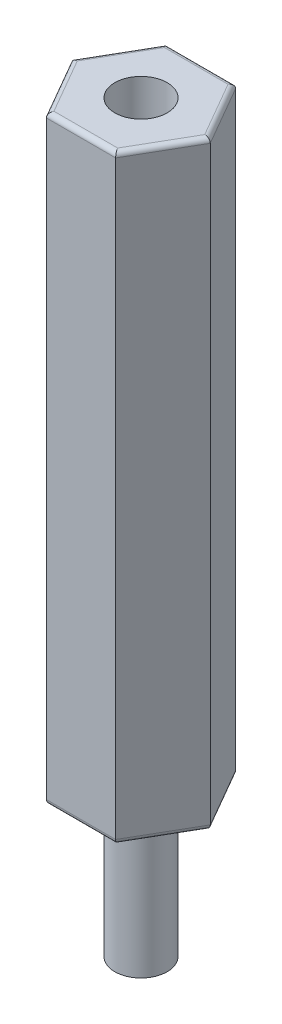
ISO-10303-21;
HEADER;
FILE_DESCRIPTION(('STEP AP214'),'2;1');
FILE_NAME('part.step','',(''),(''),'','','');
FILE_SCHEMA(('AUTOMOTIVE_DESIGN { 1 0 10303 214 1 1 1 1 }'));
ENDSEC;
DATA;
#1=APPLICATION_CONTEXT('core data for automotive mechanical design processes');
#2=APPLICATION_PROTOCOL_DEFINITION('international standard','automotive_design',2000,#1);
#3=PRODUCT_CONTEXT('',#1,'mechanical');
#4=PRODUCT('Part','Part','',(#3));
#5=PRODUCT_RELATED_PRODUCT_CATEGORY('part','',(#4));
#6=PRODUCT_DEFINITION_FORMATION('','',#4);
#7=PRODUCT_DEFINITION_CONTEXT('part definition',#1,'design');
#8=PRODUCT_DEFINITION('design','',#6,#7);
#9=PRODUCT_DEFINITION_SHAPE('','',#8);
#10=(LENGTH_UNIT() NAMED_UNIT(*) SI_UNIT(.MILLI.,.METRE.));
#11=(NAMED_UNIT(*) PLANE_ANGLE_UNIT() SI_UNIT($,.RADIAN.));
#12=(NAMED_UNIT(*) SI_UNIT($,.STERADIAN.) SOLID_ANGLE_UNIT());
#13=UNCERTAINTY_MEASURE_WITH_UNIT(LENGTH_MEASURE(1.E-05),#10,'distance_accuracy_value','');
#14=(GEOMETRIC_REPRESENTATION_CONTEXT(3) GLOBAL_UNCERTAINTY_ASSIGNED_CONTEXT((#13)) GLOBAL_UNIT_ASSIGNED_CONTEXT((#10,
#11,#12)) REPRESENTATION_CONTEXT('',''));
#15=CARTESIAN_POINT('',(0.,0.,0.));
#16=DIRECTION('',(0.,0.,1.));
#17=DIRECTION('',(1.,0.,0.));
#18=AXIS2_PLACEMENT_3D('',#15,#16,#17);
#19=CARTESIAN_POINT('',(2.88675134594813,0.,0.));
#20=DIRECTION('',(0.,1.,0.));
#21=DIRECTION('',(0.,0.,1.));
#22=AXIS2_PLACEMENT_3D('',#19,#20,#21);
#23=PLANE('',#22);
#24=DIRECTION('',(0.5,0.,-0.866025403784439));
#25=VECTOR('',#24,1.);
#26=CARTESIAN_POINT('',(2.71354626519124,0.,-0.100000000000001));
#27=LINE('',#26,#25);
#28=CARTESIAN_POINT('',(2.65581123827228,0.,0.));
#29=VERTEX_POINT('',#28);
#30=CARTESIAN_POINT('',(1.32790561913614,0.,2.3));
#31=VERTEX_POINT('',#30);
#32=EDGE_CURVE('E188',#29,#31,#27,.F.);
#33=ORIENTED_EDGE('',*,*,#32,.T.);
#34=DIRECTION('',(1.,0.,0.));
#35=VECTOR('',#34,1.);
#36=CARTESIAN_POINT('',(2.88675134594813,0.,2.3));
#37=LINE('',#36,#35);
#38=CARTESIAN_POINT('',(-1.32790561913614,0.,2.3));
#39=VERTEX_POINT('',#38);
#40=EDGE_CURVE('E41',#31,#39,#37,.F.);
#41=ORIENTED_EDGE('',*,*,#40,.T.);
#42=DIRECTION('',(0.5,0.,0.866025403784439));
#43=VECTOR('',#42,1.);
#44=CARTESIAN_POINT('',(-1.27017059221718,0.,2.4));
#45=LINE('',#44,#43);
#46=CARTESIAN_POINT('',(-2.65581123827228,0.,0.));
#47=VERTEX_POINT('',#46);
#48=EDGE_CURVE('E55',#39,#47,#45,.F.);
#49=ORIENTED_EDGE('',*,*,#48,.T.);
#50=DIRECTION('',(-0.5,0.,0.866025403784439));
#51=VECTOR('',#50,1.);
#52=CARTESIAN_POINT('',(-1.27017059221718,0.,-2.4));
#53=LINE('',#52,#51);
#54=CARTESIAN_POINT('',(-1.32790561913614,0.,-2.3));
#55=VERTEX_POINT('',#54);
#56=EDGE_CURVE('E194',#47,#55,#53,.F.);
#57=ORIENTED_EDGE('',*,*,#56,.T.);
#58=DIRECTION('',(-1.,0.,0.));
#59=VECTOR('',#58,1.);
#60=CARTESIAN_POINT('',(2.88675134594813,0.,-2.3));
#61=LINE('',#60,#59);
#62=CARTESIAN_POINT('',(1.32790561913614,0.,-2.3));
#63=VERTEX_POINT('',#62);
#64=EDGE_CURVE('E192',#55,#63,#61,.F.);
#65=ORIENTED_EDGE('',*,*,#64,.T.);
#66=DIRECTION('',(-0.5,0.,-0.866025403784439));
#67=VECTOR('',#66,1.);
#68=CARTESIAN_POINT('',(2.71354626519124,0.,0.0999999999999995));
#69=LINE('',#68,#67);
#70=EDGE_CURVE('E190',#63,#29,#69,.F.);
#71=ORIENTED_EDGE('',*,*,#70,.T.);
#72=EDGE_LOOP('',(#33,#41,#49,#57,#65,#71));
#73=FACE_BOUND('',#72,.T.);
#74=CARTESIAN_POINT('',(0.,0.,0.));
#75=DIRECTION('',(0.,1.,0.));
#76=DIRECTION('',(0.,0.,1.));
#77=AXIS2_PLACEMENT_3D('',#74,#75,#76);
#78=CIRCLE('',#77,1.0922);
#79=CARTESIAN_POINT('',(0.,0.,1.0922));
#80=VERTEX_POINT('',#79);
#81=EDGE_CURVE('E11',#80,#80,#78,.F.);
#82=ORIENTED_EDGE('',*,*,#81,.F.);
#83=EDGE_LOOP('',(#82));
#84=FACE_BOUND('',#83,.T.);
#85=ADVANCED_FACE('F33',(#73,#84),#23,.F.);
#86=CARTESIAN_POINT('',(1.44337567297406,25.,2.5));
#87=DIRECTION('',(-0.866025403784439,0.,-0.5));
#88=DIRECTION('',(-0.5,0.,0.866025403784439));
#89=AXIS2_PLACEMENT_3D('',#86,#87,#88);
#90=PLANE('',#89);
#91=DIRECTION('',(0.,-1.,0.));
#92=VECTOR('',#91,1.);
#93=CARTESIAN_POINT('',(2.88675134594813,25.,0.));
#94=LINE('',#93,#92);
#95=CARTESIAN_POINT('',(2.88675134594813,24.8,0.));
#96=VERTEX_POINT('',#95);
#97=CARTESIAN_POINT('',(2.88675134594813,0.199999999999999,0.));
#98=VERTEX_POINT('',#97);
#99=EDGE_CURVE('E149',#96,#98,#94,.T.);
#100=ORIENTED_EDGE('',*,*,#99,.F.);
#101=DIRECTION('',(0.5,0.,-0.866025403784439));
#102=VECTOR('',#101,1.);
#103=CARTESIAN_POINT('',(1.44337567297406,24.8,2.5));
#104=LINE('',#103,#102);
#105=CARTESIAN_POINT('',(1.44337567297406,24.8,2.5));
#106=VERTEX_POINT('',#105);
#107=EDGE_CURVE('E140',#96,#106,#104,.F.);
#108=ORIENTED_EDGE('',*,*,#107,.T.);
#109=DIRECTION('',(0.,-1.,0.));
#110=VECTOR('',#109,1.);
#111=CARTESIAN_POINT('',(1.44337567297406,25.,2.5));
#112=LINE('',#111,#110);
#113=CARTESIAN_POINT('',(1.44337567297406,0.199999999999999,2.5));
#114=VERTEX_POINT('',#113);
#115=EDGE_CURVE('E208',#106,#114,#112,.T.);
#116=ORIENTED_EDGE('',*,*,#115,.T.);
#117=DIRECTION('',(0.5,0.,-0.866025403784439));
#118=VECTOR('',#117,1.);
#119=CARTESIAN_POINT('',(1.44337567297406,0.199999999999999,2.5));
#120=LINE('',#119,#118);
#121=EDGE_CURVE('E181',#114,#98,#120,.T.);
#122=ORIENTED_EDGE('',*,*,#121,.T.);
#123=EDGE_LOOP('',(#100,#108,#116,#122));
#124=FACE_BOUND('',#123,.T.);
#125=ADVANCED_FACE('F253',(#124),#90,.F.);
#126=CARTESIAN_POINT('',(2.88675134594813,25.,0.));
#127=DIRECTION('',(-0.866025403784439,0.,0.5));
#128=DIRECTION('',(0.5,0.,0.866025403784439));
#129=AXIS2_PLACEMENT_3D('',#126,#127,#128);
#130=PLANE('',#129);
#131=DIRECTION('',(0.,-1.,0.));
#132=VECTOR('',#131,1.);
#133=CARTESIAN_POINT('',(1.44337567297406,25.,-2.5));
#134=LINE('',#133,#132);
#135=CARTESIAN_POINT('',(1.44337567297406,24.8,-2.5));
#136=VERTEX_POINT('',#135);
#137=CARTESIAN_POINT('',(1.44337567297406,0.199999999999999,-2.5));
#138=VERTEX_POINT('',#137);
#139=EDGE_CURVE('E152',#136,#138,#134,.T.);
#140=ORIENTED_EDGE('',*,*,#139,.F.);
#141=DIRECTION('',(-0.5,0.,-0.866025403784439));
#142=VECTOR('',#141,1.);
#143=CARTESIAN_POINT('',(2.88675134594813,24.8,0.));
#144=LINE('',#143,#142);
#145=EDGE_CURVE('E186',#136,#96,#144,.F.);
#146=ORIENTED_EDGE('',*,*,#145,.T.);
#147=ORIENTED_EDGE('',*,*,#99,.T.);
#148=DIRECTION('',(-0.5,0.,-0.866025403784439));
#149=VECTOR('',#148,1.);
#150=CARTESIAN_POINT('',(2.88675134594813,0.199999999999999,0.));
#151=LINE('',#150,#149);
#152=EDGE_CURVE('E184',#98,#138,#151,.T.);
#153=ORIENTED_EDGE('',*,*,#152,.T.);
#154=EDGE_LOOP('',(#140,#146,#147,#153));
#155=FACE_BOUND('',#154,.T.);
#156=ADVANCED_FACE('F271',(#155),#130,.F.);
#157=CARTESIAN_POINT('',(1.44337567297406,25.,-2.5));
#158=DIRECTION('',(0.,0.,1.));
#159=DIRECTION('',(1.,0.,0.));
#160=AXIS2_PLACEMENT_3D('',#157,#158,#159);
#161=PLANE('',#160);
#162=DIRECTION('',(0.,-1.,0.));
#163=VECTOR('',#162,1.);
#164=CARTESIAN_POINT('',(-1.44337567297406,25.,-2.5));
#165=LINE('',#164,#163);
#166=CARTESIAN_POINT('',(-1.44337567297406,24.8,-2.5));
#167=VERTEX_POINT('',#166);
#168=CARTESIAN_POINT('',(-1.44337567297406,0.199999999999999,-2.5));
#169=VERTEX_POINT('',#168);
#170=EDGE_CURVE('E262',#167,#169,#165,.T.);
#171=ORIENTED_EDGE('',*,*,#170,.F.);
#172=DIRECTION('',(-1.,0.,0.));
#173=VECTOR('',#172,1.);
#174=CARTESIAN_POINT('',(1.44337567297406,24.8,-2.5));
#175=LINE('',#174,#173);
#176=EDGE_CURVE('E165',#167,#136,#175,.F.);
#177=ORIENTED_EDGE('',*,*,#176,.T.);
#178=ORIENTED_EDGE('',*,*,#139,.T.);
#179=DIRECTION('',(-1.,0.,0.));
#180=VECTOR('',#179,1.);
#181=CARTESIAN_POINT('',(1.44337567297406,0.199999999999999,-2.5));
#182=LINE('',#181,#180);
#183=EDGE_CURVE('E163',#138,#169,#182,.T.);
#184=ORIENTED_EDGE('',*,*,#183,.T.);
#185=EDGE_LOOP('',(#171,#177,#178,#184));
#186=FACE_BOUND('',#185,.T.);
#187=ADVANCED_FACE('F268',(#186),#161,.F.);
#188=CARTESIAN_POINT('',(-1.44337567297406,25.,-2.5));
#189=DIRECTION('',(0.866025403784439,0.,0.5));
#190=DIRECTION('',(0.5,0.,-0.866025403784439));
#191=AXIS2_PLACEMENT_3D('',#188,#189,#190);
#192=PLANE('',#191);
#193=DIRECTION('',(0.,-1.,0.));
#194=VECTOR('',#193,1.);
#195=CARTESIAN_POINT('',(-2.88675134594813,25.,0.));
#196=LINE('',#195,#194);
#197=CARTESIAN_POINT('',(-2.88675134594813,24.8,0.));
#198=VERTEX_POINT('',#197);
#199=CARTESIAN_POINT('',(-2.88675134594813,0.199999999999999,0.));
#200=VERTEX_POINT('',#199);
#201=EDGE_CURVE('E255',#198,#200,#196,.T.);
#202=ORIENTED_EDGE('',*,*,#201,.F.);
#203=DIRECTION('',(-0.5,0.,0.866025403784439));
#204=VECTOR('',#203,1.);
#205=CARTESIAN_POINT('',(-1.44337567297406,24.8,-2.5));
#206=LINE('',#205,#204);
#207=EDGE_CURVE('E170',#198,#167,#206,.F.);
#208=ORIENTED_EDGE('',*,*,#207,.T.);
#209=ORIENTED_EDGE('',*,*,#170,.T.);
#210=DIRECTION('',(-0.5,0.,0.866025403784439));
#211=VECTOR('',#210,1.);
#212=CARTESIAN_POINT('',(-1.44337567297406,0.199999999999999,-2.5));
#213=LINE('',#212,#211);
#214=EDGE_CURVE('E168',#169,#200,#213,.T.);
#215=ORIENTED_EDGE('',*,*,#214,.T.);
#216=EDGE_LOOP('',(#202,#208,#209,#215));
#217=FACE_BOUND('',#216,.T.);
#218=ADVANCED_FACE('F278',(#217),#192,.F.);
#219=CARTESIAN_POINT('',(-2.88675134594813,25.,0.));
#220=DIRECTION('',(0.866025403784439,0.,-0.5));
#221=DIRECTION('',(-0.5,0.,-0.866025403784439));
#222=AXIS2_PLACEMENT_3D('',#219,#220,#221);
#223=PLANE('',#222);
#224=DIRECTION('',(0.,-1.,0.));
#225=VECTOR('',#224,1.);
#226=CARTESIAN_POINT('',(-1.44337567297406,25.,2.5));
#227=LINE('',#226,#225);
#228=CARTESIAN_POINT('',(-1.44337567297406,24.8,2.5));
#229=VERTEX_POINT('',#228);
#230=CARTESIAN_POINT('',(-1.44337567297406,0.199999999999999,2.5));
#231=VERTEX_POINT('',#230);
#232=EDGE_CURVE('E250',#229,#231,#227,.T.);
#233=ORIENTED_EDGE('',*,*,#232,.F.);
#234=DIRECTION('',(0.5,0.,0.866025403784439));
#235=VECTOR('',#234,1.);
#236=CARTESIAN_POINT('',(-2.88675134594813,24.8,0.));
#237=LINE('',#236,#235);
#238=EDGE_CURVE('E174',#229,#198,#237,.F.);
#239=ORIENTED_EDGE('',*,*,#238,.T.);
#240=ORIENTED_EDGE('',*,*,#201,.T.);
#241=DIRECTION('',(0.5,0.,0.866025403784439));
#242=VECTOR('',#241,1.);
#243=CARTESIAN_POINT('',(-2.88675134594813,0.199999999999999,0.));
#244=LINE('',#243,#242);
#245=EDGE_CURVE('E172',#200,#231,#244,.T.);
#246=ORIENTED_EDGE('',*,*,#245,.T.);
#247=EDGE_LOOP('',(#233,#239,#240,#246));
#248=FACE_BOUND('',#247,.T.);
#249=ADVANCED_FACE('F290',(#248),#223,.F.);
#250=CARTESIAN_POINT('',(-1.44337567297406,25.,2.5));
#251=DIRECTION('',(0.,0.,-1.));
#252=DIRECTION('',(-1.,0.,0.));
#253=AXIS2_PLACEMENT_3D('',#250,#251,#252);
#254=PLANE('',#253);
#255=ORIENTED_EDGE('',*,*,#115,.F.);
#256=DIRECTION('',(1.,0.,0.));
#257=VECTOR('',#256,1.);
#258=CARTESIAN_POINT('',(-1.44337567297406,24.8,2.5));
#259=LINE('',#258,#257);
#260=EDGE_CURVE('E179',#106,#229,#259,.F.);
#261=ORIENTED_EDGE('',*,*,#260,.T.);
#262=ORIENTED_EDGE('',*,*,#232,.T.);
#263=DIRECTION('',(1.,0.,0.));
#264=VECTOR('',#263,1.);
#265=CARTESIAN_POINT('',(-1.44337567297406,0.199999999999999,2.5));
#266=LINE('',#265,#264);
#267=EDGE_CURVE('E176',#231,#114,#266,.T.);
#268=ORIENTED_EDGE('',*,*,#267,.T.);
#269=EDGE_LOOP('',(#255,#261,#262,#268));
#270=FACE_BOUND('',#269,.T.);
#271=ADVANCED_FACE('F247',(#270),#254,.F.);
#272=CARTESIAN_POINT('',(2.88675134594813,25.,0.));
#273=DIRECTION('',(0.,1.,0.));
#274=DIRECTION('',(0.,0.,1.));
#275=AXIS2_PLACEMENT_3D('',#272,#273,#274);
#276=PLANE('',#275);
#277=CARTESIAN_POINT('',(0.,25.,0.));
#278=DIRECTION('',(0.,1.,0.));
#279=DIRECTION('',(0.,0.,1.));
#280=AXIS2_PLACEMENT_3D('',#277,#278,#279);
#281=CIRCLE('',#280,1.0922);
#282=CARTESIAN_POINT('',(0.,25.,1.0922));
#283=VERTEX_POINT('',#282);
#284=EDGE_CURVE('E373',#283,#283,#281,.T.);
#285=ORIENTED_EDGE('',*,*,#284,.F.);
#286=EDGE_LOOP('',(#285));
#287=FACE_BOUND('',#286,.T.);
#288=DIRECTION('',(-0.5,0.,-0.866025403784439));
#289=VECTOR('',#288,1.);
#290=CARTESIAN_POINT('',(1.27017059221718,25.,-2.4));
#291=LINE('',#290,#289);
#292=CARTESIAN_POINT('',(2.65581123827228,25.,0.));
#293=VERTEX_POINT('',#292);
#294=CARTESIAN_POINT('',(1.32790561913614,25.,-2.3));
#295=VERTEX_POINT('',#294);
#296=EDGE_CURVE('E128',#293,#295,#291,.T.);
#297=ORIENTED_EDGE('',*,*,#296,.T.);
#298=DIRECTION('',(-1.,0.,0.));
#299=VECTOR('',#298,1.);
#300=CARTESIAN_POINT('',(-1.44337567297406,25.,-2.3));
#301=LINE('',#300,#299);
#302=CARTESIAN_POINT('',(-1.32790561913614,25.,-2.3));
#303=VERTEX_POINT('',#302);
#304=EDGE_CURVE('E161',#295,#303,#301,.T.);
#305=ORIENTED_EDGE('',*,*,#304,.T.);
#306=DIRECTION('',(-0.5,0.,0.866025403784439));
#307=VECTOR('',#306,1.);
#308=CARTESIAN_POINT('',(-2.71354626519124,25.,0.100000000000001));
#309=LINE('',#308,#307);
#310=CARTESIAN_POINT('',(-2.65581123827228,25.,0.));
#311=VERTEX_POINT('',#310);
#312=EDGE_CURVE('E159',#303,#311,#309,.T.);
#313=ORIENTED_EDGE('',*,*,#312,.T.);
#314=DIRECTION('',(0.5,0.,0.866025403784439));
#315=VECTOR('',#314,1.);
#316=CARTESIAN_POINT('',(-1.27017059221718,25.,2.4));
#317=LINE('',#316,#315);
#318=CARTESIAN_POINT('',(-1.32790561913614,25.,2.3));
#319=VERTEX_POINT('',#318);
#320=EDGE_CURVE('E157',#311,#319,#317,.T.);
#321=ORIENTED_EDGE('',*,*,#320,.T.);
#322=DIRECTION('',(1.,0.,0.));
#323=VECTOR('',#322,1.);
#324=CARTESIAN_POINT('',(1.44337567297406,25.,2.3));
#325=LINE('',#324,#323);
#326=CARTESIAN_POINT('',(1.32790561913614,25.,2.3));
#327=VERTEX_POINT('',#326);
#328=EDGE_CURVE('E131',#319,#327,#325,.T.);
#329=ORIENTED_EDGE('',*,*,#328,.T.);
#330=DIRECTION('',(0.5,0.,-0.866025403784439));
#331=VECTOR('',#330,1.);
#332=CARTESIAN_POINT('',(2.71354626519124,25.,-0.100000000000001));
#333=LINE('',#332,#331);
#334=EDGE_CURVE('E123',#327,#293,#333,.T.);
#335=ORIENTED_EDGE('',*,*,#334,.T.);
#336=EDGE_LOOP('',(#297,#305,#313,#321,#329,#335));
#337=FACE_BOUND('',#336,.T.);
#338=ADVANCED_FACE('F125',(#287,#337),#276,.T.);
#339=CARTESIAN_POINT('',(2.88675134594813,24.8,2.3));
#340=DIRECTION('',(-1.,0.,0.));
#341=DIRECTION('',(0.,0.,1.));
#342=AXIS2_PLACEMENT_3D('',#339,#340,#341);
#343=CYLINDRICAL_SURFACE('',#342,0.2);
#344=CARTESIAN_POINT('',(-1.32790561913614,24.8,2.3));
#345=DIRECTION('',(-0.866025403784439,0.,-0.5));
#346=DIRECTION('',(-0.5,0.,0.866025403784439));
#347=AXIS2_PLACEMENT_3D('',#344,#345,#346);
#348=ELLIPSE('',#347,0.23094010767585,0.2);
#349=EDGE_CURVE('E143',#229,#319,#348,.T.);
#350=ORIENTED_EDGE('',*,*,#349,.F.);
#351=ORIENTED_EDGE('',*,*,#260,.F.);
#352=CARTESIAN_POINT('',(1.32790561913614,24.8,2.3));
#353=DIRECTION('',(-0.866025403784438,0.,0.5));
#354=DIRECTION('',(0.5,0.,0.866025403784439));
#355=AXIS2_PLACEMENT_3D('',#352,#353,#354);
#356=ELLIPSE('',#355,0.23094010767585,0.2);
#357=EDGE_CURVE('E206',#327,#106,#356,.F.);
#358=ORIENTED_EDGE('',*,*,#357,.F.);
#359=ORIENTED_EDGE('',*,*,#328,.F.);
#360=EDGE_LOOP('',(#350,#351,#358,#359));
#361=FACE_BOUND('',#360,.T.);
#362=ADVANCED_FACE('F313',(#361),#343,.T.);
#363=CARTESIAN_POINT('',(2.71354626519124,24.8,-0.100000000000001));
#364=DIRECTION('',(-0.5,0.,0.866025403784439));
#365=DIRECTION('',(0.866025403784439,0.,0.5));
#366=AXIS2_PLACEMENT_3D('',#363,#364,#365);
#367=CYLINDRICAL_SURFACE('',#366,0.2);
#368=ORIENTED_EDGE('',*,*,#357,.T.);
#369=ORIENTED_EDGE('',*,*,#107,.F.);
#370=CARTESIAN_POINT('',(2.65581123827228,24.8,0.));
#371=DIRECTION('',(0.,0.,1.));
#372=DIRECTION('',(1.,0.,0.));
#373=AXIS2_PLACEMENT_3D('',#370,#371,#372);
#374=ELLIPSE('',#373,0.23094010767585,0.2);
#375=EDGE_CURVE('E138',#293,#96,#374,.F.);
#376=ORIENTED_EDGE('',*,*,#375,.F.);
#377=ORIENTED_EDGE('',*,*,#334,.F.);
#378=EDGE_LOOP('',(#368,#369,#376,#377));
#379=FACE_BOUND('',#378,.T.);
#380=ADVANCED_FACE('F139',(#379),#367,.T.);
#381=CARTESIAN_POINT('',(-1.27017059221718,24.8,2.4));
#382=DIRECTION('',(-0.5,0.,-0.866025403784439));
#383=DIRECTION('',(-0.866025403784439,0.,0.5));
#384=AXIS2_PLACEMENT_3D('',#381,#382,#383);
#385=CYLINDRICAL_SURFACE('',#384,0.2);
#386=ORIENTED_EDGE('',*,*,#349,.T.);
#387=ORIENTED_EDGE('',*,*,#320,.F.);
#388=CARTESIAN_POINT('',(-2.65581123827228,24.8,0.));
#389=DIRECTION('',(0.,0.,-1.));
#390=DIRECTION('',(-1.,0.,0.));
#391=AXIS2_PLACEMENT_3D('',#388,#389,#390);
#392=ELLIPSE('',#391,0.23094010767585,0.2);
#393=EDGE_CURVE('E144',#198,#311,#392,.T.);
#394=ORIENTED_EDGE('',*,*,#393,.F.);
#395=ORIENTED_EDGE('',*,*,#238,.F.);
#396=EDGE_LOOP('',(#386,#387,#394,#395));
#397=FACE_BOUND('',#396,.T.);
#398=ADVANCED_FACE('F304',(#397),#385,.T.);
#399=CARTESIAN_POINT('',(2.71354626519124,24.8,0.0999999999999995));
#400=DIRECTION('',(0.5,0.,0.866025403784439));
#401=DIRECTION('',(0.866025403784439,0.,-0.5));
#402=AXIS2_PLACEMENT_3D('',#399,#400,#401);
#403=CYLINDRICAL_SURFACE('',#402,0.2);
#404=ORIENTED_EDGE('',*,*,#375,.T.);
#405=ORIENTED_EDGE('',*,*,#145,.F.);
#406=CARTESIAN_POINT('',(1.32790561913614,24.8,-2.3));
#407=DIRECTION('',(0.866025403784439,0.,0.5));
#408=DIRECTION('',(-0.5,0.,0.866025403784439));
#409=AXIS2_PLACEMENT_3D('',#406,#407,#408);
#410=ELLIPSE('',#409,0.23094010767585,0.2);
#411=EDGE_CURVE('E147',#295,#136,#410,.F.);
#412=ORIENTED_EDGE('',*,*,#411,.F.);
#413=ORIENTED_EDGE('',*,*,#296,.F.);
#414=EDGE_LOOP('',(#404,#405,#412,#413));
#415=FACE_BOUND('',#414,.T.);
#416=ADVANCED_FACE('F146',(#415),#403,.T.);
#417=CARTESIAN_POINT('',(-1.27017059221718,24.8,-2.4));
#418=DIRECTION('',(0.5,0.,-0.866025403784439));
#419=DIRECTION('',(-0.866025403784439,0.,-0.5));
#420=AXIS2_PLACEMENT_3D('',#417,#418,#419);
#421=CYLINDRICAL_SURFACE('',#420,0.2);
#422=ORIENTED_EDGE('',*,*,#393,.T.);
#423=ORIENTED_EDGE('',*,*,#312,.F.);
#424=CARTESIAN_POINT('',(-1.32790561913614,24.8,-2.3));
#425=DIRECTION('',(0.866025403784439,0.,-0.5));
#426=DIRECTION('',(-0.5,0.,-0.866025403784439));
#427=AXIS2_PLACEMENT_3D('',#424,#425,#426);
#428=ELLIPSE('',#427,0.23094010767585,0.2);
#429=EDGE_CURVE('E198',#167,#303,#428,.T.);
#430=ORIENTED_EDGE('',*,*,#429,.F.);
#431=ORIENTED_EDGE('',*,*,#207,.F.);
#432=EDGE_LOOP('',(#422,#423,#430,#431));
#433=FACE_BOUND('',#432,.T.);
#434=ADVANCED_FACE('F308',(#433),#421,.T.);
#435=CARTESIAN_POINT('',(2.88675134594813,24.8,-2.3));
#436=DIRECTION('',(1.,0.,0.));
#437=DIRECTION('',(0.,0.,-1.));
#438=AXIS2_PLACEMENT_3D('',#435,#436,#437);
#439=CYLINDRICAL_SURFACE('',#438,0.2);
#440=ORIENTED_EDGE('',*,*,#411,.T.);
#441=ORIENTED_EDGE('',*,*,#176,.F.);
#442=ORIENTED_EDGE('',*,*,#429,.T.);
#443=ORIENTED_EDGE('',*,*,#304,.F.);
#444=EDGE_LOOP('',(#440,#441,#442,#443));
#445=FACE_BOUND('',#444,.T.);
#446=ADVANCED_FACE('F310',(#445),#439,.T.);
#447=CARTESIAN_POINT('',(1.44337567297406,0.199999999999999,-2.3));
#448=DIRECTION('',(-1.,0.,0.));
#449=DIRECTION('',(0.,0.,1.));
#450=AXIS2_PLACEMENT_3D('',#447,#448,#449);
#451=CYLINDRICAL_SURFACE('',#450,0.2);
#452=CARTESIAN_POINT('',(1.32790561913614,0.199999999999999,-2.3));
#453=DIRECTION('',(-0.866025403784439,0.,-0.5));
#454=DIRECTION('',(0.5,0.,-0.866025403784439));
#455=AXIS2_PLACEMENT_3D('',#452,#453,#454);
#456=ELLIPSE('',#455,0.23094010767585,0.2);
#457=EDGE_CURVE('E219',#63,#138,#456,.F.);
#458=ORIENTED_EDGE('',*,*,#457,.F.);
#459=ORIENTED_EDGE('',*,*,#64,.F.);
#460=CARTESIAN_POINT('',(-1.32790561913614,0.199999999999999,-2.3));
#461=DIRECTION('',(-0.866025403784439,0.,0.5));
#462=DIRECTION('',(-0.5,0.,-0.866025403784439));
#463=AXIS2_PLACEMENT_3D('',#460,#461,#462);
#464=ELLIPSE('',#463,0.23094010767585,0.2);
#465=EDGE_CURVE('E200',#169,#55,#464,.T.);
#466=ORIENTED_EDGE('',*,*,#465,.F.);
#467=ORIENTED_EDGE('',*,*,#183,.F.);
#468=EDGE_LOOP('',(#458,#459,#466,#467));
#469=FACE_BOUND('',#468,.T.);
#470=ADVANCED_FACE('F35',(#469),#451,.T.);
#471=CARTESIAN_POINT('',(-1.27017059221718,0.199999999999999,-2.4));
#472=DIRECTION('',(-0.5,0.,0.866025403784439));
#473=DIRECTION('',(0.866025403784439,0.,0.5));
#474=AXIS2_PLACEMENT_3D('',#471,#472,#473);
#475=CYLINDRICAL_SURFACE('',#474,0.2);
#476=ORIENTED_EDGE('',*,*,#465,.T.);
#477=ORIENTED_EDGE('',*,*,#56,.F.);
#478=CARTESIAN_POINT('',(-2.65581123827228,0.199999999999999,0.));
#479=DIRECTION('',(0.,0.,1.));
#480=DIRECTION('',(-1.,0.,0.));
#481=AXIS2_PLACEMENT_3D('',#478,#479,#480);
#482=ELLIPSE('',#481,0.23094010767585,0.2);
#483=EDGE_CURVE('E216',#200,#47,#482,.T.);
#484=ORIENTED_EDGE('',*,*,#483,.F.);
#485=ORIENTED_EDGE('',*,*,#214,.F.);
#486=EDGE_LOOP('',(#476,#477,#484,#485));
#487=FACE_BOUND('',#486,.T.);
#488=ADVANCED_FACE('F225',(#487),#475,.T.);
#489=CARTESIAN_POINT('',(2.71354626519124,0.199999999999999,0.0999999999999992));
#490=DIRECTION('',(-0.5,0.,-0.866025403784439));
#491=DIRECTION('',(-0.866025403784439,0.,0.5));
#492=AXIS2_PLACEMENT_3D('',#489,#490,#491);
#493=CYLINDRICAL_SURFACE('',#492,0.2);
#494=ORIENTED_EDGE('',*,*,#457,.T.);
#495=ORIENTED_EDGE('',*,*,#152,.F.);
#496=CARTESIAN_POINT('',(2.65581123827228,0.199999999999999,0.));
#497=DIRECTION('',(0.,0.,-1.));
#498=DIRECTION('',(1.,0.,0.));
#499=AXIS2_PLACEMENT_3D('',#496,#497,#498);
#500=ELLIPSE('',#499,0.23094010767585,0.2);
#501=EDGE_CURVE('E213',#29,#98,#500,.F.);
#502=ORIENTED_EDGE('',*,*,#501,.F.);
#503=ORIENTED_EDGE('',*,*,#70,.F.);
#504=EDGE_LOOP('',(#494,#495,#502,#503));
#505=FACE_BOUND('',#504,.T.);
#506=ADVANCED_FACE('F237',(#505),#493,.T.);
#507=CARTESIAN_POINT('',(-2.71354626519124,0.199999999999999,-0.0999999999999996));
#508=DIRECTION('',(0.5,0.,0.866025403784439));
#509=DIRECTION('',(0.866025403784439,0.,-0.5));
#510=AXIS2_PLACEMENT_3D('',#507,#508,#509);
#511=CYLINDRICAL_SURFACE('',#510,0.2);
#512=ORIENTED_EDGE('',*,*,#483,.T.);
#513=ORIENTED_EDGE('',*,*,#48,.F.);
#514=CARTESIAN_POINT('',(-1.32790561913614,0.199999999999999,2.3));
#515=DIRECTION('',(0.866025403784439,0.,0.5));
#516=DIRECTION('',(-0.5,0.,0.866025403784439));
#517=AXIS2_PLACEMENT_3D('',#514,#515,#516);
#518=ELLIPSE('',#517,0.23094010767585,0.2);
#519=EDGE_CURVE('E48',#231,#39,#518,.T.);
#520=ORIENTED_EDGE('',*,*,#519,.F.);
#521=ORIENTED_EDGE('',*,*,#245,.F.);
#522=EDGE_LOOP('',(#512,#513,#520,#521));
#523=FACE_BOUND('',#522,.T.);
#524=ADVANCED_FACE('F316',(#523),#511,.T.);
#525=CARTESIAN_POINT('',(1.27017059221718,0.199999999999999,2.4));
#526=DIRECTION('',(0.5,0.,-0.866025403784439));
#527=DIRECTION('',(-0.866025403784439,0.,-0.5));
#528=AXIS2_PLACEMENT_3D('',#525,#526,#527);
#529=CYLINDRICAL_SURFACE('',#528,0.2);
#530=ORIENTED_EDGE('',*,*,#501,.T.);
#531=ORIENTED_EDGE('',*,*,#121,.F.);
#532=CARTESIAN_POINT('',(1.32790561913614,0.199999999999999,2.3));
#533=DIRECTION('',(0.866025403784438,0.,-0.5));
#534=DIRECTION('',(-0.5,0.,-0.866025403784439));
#535=AXIS2_PLACEMENT_3D('',#532,#533,#534);
#536=ELLIPSE('',#535,0.23094010767585,0.2);
#537=EDGE_CURVE('E209',#31,#114,#536,.F.);
#538=ORIENTED_EDGE('',*,*,#537,.F.);
#539=ORIENTED_EDGE('',*,*,#32,.F.);
#540=EDGE_LOOP('',(#530,#531,#538,#539));
#541=FACE_BOUND('',#540,.T.);
#542=ADVANCED_FACE('F241',(#541),#529,.T.);
#543=CARTESIAN_POINT('',(-1.44337567297406,0.199999999999999,2.3));
#544=DIRECTION('',(1.,0.,0.));
#545=DIRECTION('',(0.,0.,-1.));
#546=AXIS2_PLACEMENT_3D('',#543,#544,#545);
#547=CYLINDRICAL_SURFACE('',#546,0.2);
#548=ORIENTED_EDGE('',*,*,#519,.T.);
#549=ORIENTED_EDGE('',*,*,#40,.F.);
#550=ORIENTED_EDGE('',*,*,#537,.T.);
#551=ORIENTED_EDGE('',*,*,#267,.F.);
#552=EDGE_LOOP('',(#548,#549,#550,#551));
#553=FACE_BOUND('',#552,.T.);
#554=ADVANCED_FACE('F242',(#553),#547,.T.);
#555=CARTESIAN_POINT('',(0.,-6.,0.));
#556=DIRECTION('',(0.,1.,0.));
#557=DIRECTION('',(0.,0.,1.));
#558=AXIS2_PLACEMENT_3D('',#555,#556,#557);
#559=CYLINDRICAL_SURFACE('',#558,1.0922);
#560=CARTESIAN_POINT('',(0.,-6.,0.));
#561=DIRECTION('',(0.,-1.,0.));
#562=DIRECTION('',(0.,0.,-1.));
#563=AXIS2_PLACEMENT_3D('',#560,#561,#562);
#564=CIRCLE('',#563,1.0922);
#565=CARTESIAN_POINT('',(0.,-6.,-1.0922));
#566=VERTEX_POINT('',#565);
#567=EDGE_CURVE('E211',#566,#566,#564,.T.);
#568=ORIENTED_EDGE('',*,*,#567,.F.);
#569=EDGE_LOOP('',(#568));
#570=FACE_BOUND('',#569,.T.);
#571=ORIENTED_EDGE('',*,*,#81,.T.);
#572=EDGE_LOOP('',(#571));
#573=FACE_BOUND('',#572,.T.);
#574=ADVANCED_FACE('F347',(#570,#573),#559,.T.);
#575=CARTESIAN_POINT('',(0.,-6.,0.));
#576=DIRECTION('',(0.,-1.,0.));
#577=DIRECTION('',(0.,0.,-1.));
#578=AXIS2_PLACEMENT_3D('',#575,#576,#577);
#579=PLANE('',#578);
#580=ORIENTED_EDGE('',*,*,#567,.T.);
#581=EDGE_LOOP('',(#580));
#582=FACE_BOUND('',#581,.T.);
#583=ADVANCED_FACE('F351',(#582),#579,.T.);
#584=CARTESIAN_POINT('',(0.,20.24,0.));
#585=DIRECTION('',(0.,1.,0.));
#586=DIRECTION('',(0.,0.,1.));
#587=AXIS2_PLACEMENT_3D('',#584,#585,#586);
#588=CYLINDRICAL_SURFACE('',#587,1.0922);
#589=CARTESIAN_POINT('',(0.,20.24,0.));
#590=DIRECTION('',(0.,1.,0.));
#591=DIRECTION('',(0.,0.,1.));
#592=AXIS2_PLACEMENT_3D('',#589,#590,#591);
#593=CIRCLE('',#592,1.0922);
#594=CARTESIAN_POINT('',(0.,20.24,1.0922));
#595=VERTEX_POINT('',#594);
#596=EDGE_CURVE('E372',#595,#595,#593,.T.);
#597=ORIENTED_EDGE('',*,*,#596,.F.);
#598=EDGE_LOOP('',(#597));
#599=FACE_BOUND('',#598,.T.);
#600=ORIENTED_EDGE('',*,*,#284,.T.);
#601=EDGE_LOOP('',(#600));
#602=FACE_BOUND('',#601,.T.);
#603=ADVANCED_FACE('F356',(#599,#602),#588,.F.);
#604=CARTESIAN_POINT('',(0.,20.24,0.));
#605=DIRECTION('',(0.,1.,0.));
#606=DIRECTION('',(0.,0.,1.));
#607=AXIS2_PLACEMENT_3D('',#604,#605,#606);
#608=PLANE('',#607);
#609=ORIENTED_EDGE('',*,*,#596,.T.);
#610=EDGE_LOOP('',(#609));
#611=FACE_BOUND('',#610,.T.);
#612=ADVANCED_FACE('F364',(#611),#608,.T.);
#613=CLOSED_SHELL('',(#85,#125,#156,#187,#218,#249,#271,#338,#362,#380,#398,#416,#434,#446,#470,
#488,#506,#524,#542,#554,#574,#583,#603,#612));
#614=MANIFOLD_SOLID_BREP('B2',#613);
#615=ADVANCED_BREP_SHAPE_REPRESENTATION('',(#18,#614),#14);
#616=SHAPE_DEFINITION_REPRESENTATION(#9,#615);
ENDSEC;
END-ISO-10303-21;
